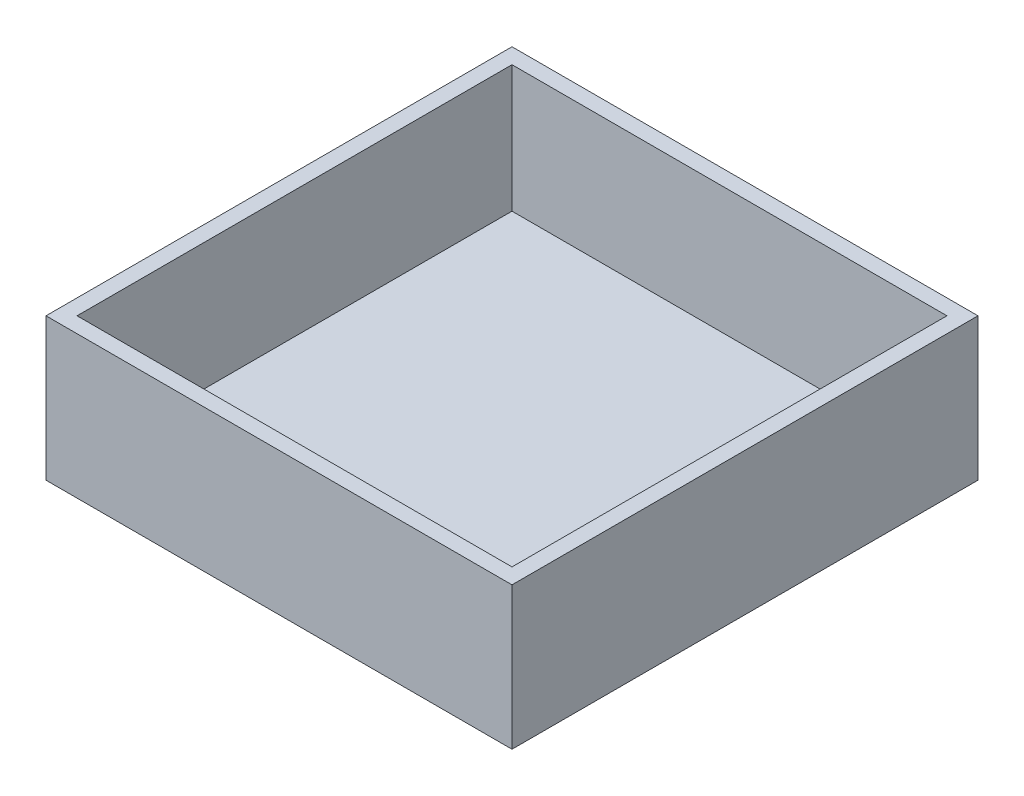
ISO-10303-21;
HEADER;
FILE_DESCRIPTION(('STEP AP214'),'2;1');
FILE_NAME('part.step','',(''),(''),'','','');
FILE_SCHEMA(('AUTOMOTIVE_DESIGN { 1 0 10303 214 1 1 1 1 }'));
ENDSEC;
DATA;
#1=APPLICATION_CONTEXT('core data for automotive mechanical design processes');
#2=APPLICATION_PROTOCOL_DEFINITION('international standard','automotive_design',2000,#1);
#3=PRODUCT_CONTEXT('',#1,'mechanical');
#4=PRODUCT('Part','Part','',(#3));
#5=PRODUCT_RELATED_PRODUCT_CATEGORY('part','',(#4));
#6=PRODUCT_DEFINITION_FORMATION('','',#4);
#7=PRODUCT_DEFINITION_CONTEXT('part definition',#1,'design');
#8=PRODUCT_DEFINITION('design','',#6,#7);
#9=PRODUCT_DEFINITION_SHAPE('','',#8);
#10=(LENGTH_UNIT() NAMED_UNIT(*) SI_UNIT(.MILLI.,.METRE.));
#11=(NAMED_UNIT(*) PLANE_ANGLE_UNIT() SI_UNIT($,.RADIAN.));
#12=(NAMED_UNIT(*) SI_UNIT($,.STERADIAN.) SOLID_ANGLE_UNIT());
#13=UNCERTAINTY_MEASURE_WITH_UNIT(LENGTH_MEASURE(1.E-05),#10,'distance_accuracy_value','');
#14=(GEOMETRIC_REPRESENTATION_CONTEXT(3) GLOBAL_UNCERTAINTY_ASSIGNED_CONTEXT((#13)) GLOBAL_UNIT_ASSIGNED_CONTEXT((#10,
#11,#12)) REPRESENTATION_CONTEXT('',''));
#15=CARTESIAN_POINT('',(0.,0.,0.));
#16=DIRECTION('',(0.,0.,1.));
#17=DIRECTION('',(1.,0.,0.));
#18=AXIS2_PLACEMENT_3D('',#15,#16,#17);
#19=CARTESIAN_POINT('',(45.,27.5,45.));
#20=DIRECTION('',(-1.,0.,0.));
#21=DIRECTION('',(0.,0.,1.));
#22=AXIS2_PLACEMENT_3D('',#19,#20,#21);
#23=PLANE('',#22);
#24=DIRECTION('',(0.,0.,-1.));
#25=VECTOR('',#24,1.);
#26=CARTESIAN_POINT('',(45.,0.,45.));
#27=LINE('',#26,#25);
#28=CARTESIAN_POINT('',(45.,0.,45.));
#29=VERTEX_POINT('',#28);
#30=CARTESIAN_POINT('',(45.,0.,-45.));
#31=VERTEX_POINT('',#30);
#32=EDGE_CURVE('E146',#29,#31,#27,.T.);
#33=ORIENTED_EDGE('',*,*,#32,.T.);
#34=DIRECTION('',(0.,-1.,0.));
#35=VECTOR('',#34,1.);
#36=CARTESIAN_POINT('',(45.,27.5,-45.));
#37=LINE('',#36,#35);
#38=CARTESIAN_POINT('',(45.,27.5,-45.));
#39=VERTEX_POINT('',#38);
#40=EDGE_CURVE('E12',#39,#31,#37,.T.);
#41=ORIENTED_EDGE('',*,*,#40,.F.);
#42=DIRECTION('',(0.,0.,-1.));
#43=VECTOR('',#42,1.);
#44=CARTESIAN_POINT('',(45.,27.5,45.));
#45=LINE('',#44,#43);
#46=CARTESIAN_POINT('',(45.,27.5,45.));
#47=VERTEX_POINT('',#46);
#48=EDGE_CURVE('E147',#47,#39,#45,.T.);
#49=ORIENTED_EDGE('',*,*,#48,.F.);
#50=DIRECTION('',(0.,-1.,0.));
#51=VECTOR('',#50,1.);
#52=CARTESIAN_POINT('',(45.,27.5,45.));
#53=LINE('',#52,#51);
#54=EDGE_CURVE('E153',#47,#29,#53,.T.);
#55=ORIENTED_EDGE('',*,*,#54,.T.);
#56=EDGE_LOOP('',(#33,#41,#49,#55));
#57=FACE_BOUND('',#56,.T.);
#58=ADVANCED_FACE('F35',(#57),#23,.F.);
#59=CARTESIAN_POINT('',(-45.,27.5,-45.));
#60=DIRECTION('',(0.,0.,1.));
#61=DIRECTION('',(1.,0.,0.));
#62=AXIS2_PLACEMENT_3D('',#59,#60,#61);
#63=PLANE('',#62);
#64=DIRECTION('',(-1.,0.,0.));
#65=VECTOR('',#64,1.);
#66=CARTESIAN_POINT('',(-45.,0.,-45.));
#67=LINE('',#66,#65);
#68=CARTESIAN_POINT('',(-45.,0.,-45.));
#69=VERTEX_POINT('',#68);
#70=EDGE_CURVE('E156',#31,#69,#67,.T.);
#71=ORIENTED_EDGE('',*,*,#70,.T.);
#72=DIRECTION('',(0.,-1.,0.));
#73=VECTOR('',#72,1.);
#74=CARTESIAN_POINT('',(-45.,27.5,-45.));
#75=LINE('',#74,#73);
#76=CARTESIAN_POINT('',(-45.,27.5,-45.));
#77=VERTEX_POINT('',#76);
#78=EDGE_CURVE('E42',#77,#69,#75,.T.);
#79=ORIENTED_EDGE('',*,*,#78,.F.);
#80=DIRECTION('',(-1.,0.,0.));
#81=VECTOR('',#80,1.);
#82=CARTESIAN_POINT('',(-45.,27.5,-45.));
#83=LINE('',#82,#81);
#84=EDGE_CURVE('E86',#39,#77,#83,.T.);
#85=ORIENTED_EDGE('',*,*,#84,.F.);
#86=ORIENTED_EDGE('',*,*,#40,.T.);
#87=EDGE_LOOP('',(#71,#79,#85,#86));
#88=FACE_BOUND('',#87,.T.);
#89=ADVANCED_FACE('F185',(#88),#63,.F.);
#90=CARTESIAN_POINT('',(-45.,27.5,45.));
#91=DIRECTION('',(1.,0.,0.));
#92=DIRECTION('',(0.,0.,-1.));
#93=AXIS2_PLACEMENT_3D('',#90,#91,#92);
#94=PLANE('',#93);
#95=DIRECTION('',(0.,0.,1.));
#96=VECTOR('',#95,1.);
#97=CARTESIAN_POINT('',(-45.,0.,45.));
#98=LINE('',#97,#96);
#99=CARTESIAN_POINT('',(-45.,0.,45.));
#100=VERTEX_POINT('',#99);
#101=EDGE_CURVE('E158',#69,#100,#98,.T.);
#102=ORIENTED_EDGE('',*,*,#101,.T.);
#103=DIRECTION('',(0.,-1.,0.));
#104=VECTOR('',#103,1.);
#105=CARTESIAN_POINT('',(-45.,27.5,45.));
#106=LINE('',#105,#104);
#107=CARTESIAN_POINT('',(-45.,27.5,45.));
#108=VERTEX_POINT('',#107);
#109=EDGE_CURVE('E162',#108,#100,#106,.T.);
#110=ORIENTED_EDGE('',*,*,#109,.F.);
#111=DIRECTION('',(0.,0.,1.));
#112=VECTOR('',#111,1.);
#113=CARTESIAN_POINT('',(-45.,27.5,45.));
#114=LINE('',#113,#112);
#115=EDGE_CURVE('E150',#77,#108,#114,.T.);
#116=ORIENTED_EDGE('',*,*,#115,.F.);
#117=ORIENTED_EDGE('',*,*,#78,.T.);
#118=EDGE_LOOP('',(#102,#110,#116,#117));
#119=FACE_BOUND('',#118,.T.);
#120=ADVANCED_FACE('F167',(#119),#94,.F.);
#121=CARTESIAN_POINT('',(-45.,27.5,45.));
#122=DIRECTION('',(0.,0.,-1.));
#123=DIRECTION('',(-1.,0.,0.));
#124=AXIS2_PLACEMENT_3D('',#121,#122,#123);
#125=PLANE('',#124);
#126=DIRECTION('',(1.,0.,0.));
#127=VECTOR('',#126,1.);
#128=CARTESIAN_POINT('',(-45.,0.,45.));
#129=LINE('',#128,#127);
#130=EDGE_CURVE('E79',#100,#29,#129,.T.);
#131=ORIENTED_EDGE('',*,*,#130,.T.);
#132=ORIENTED_EDGE('',*,*,#54,.F.);
#133=DIRECTION('',(1.,0.,0.));
#134=VECTOR('',#133,1.);
#135=CARTESIAN_POINT('',(-45.,27.5,45.));
#136=LINE('',#135,#134);
#137=EDGE_CURVE('E58',#108,#47,#136,.T.);
#138=ORIENTED_EDGE('',*,*,#137,.F.);
#139=ORIENTED_EDGE('',*,*,#109,.T.);
#140=EDGE_LOOP('',(#131,#132,#138,#139));
#141=FACE_BOUND('',#140,.T.);
#142=ADVANCED_FACE('F175',(#141),#125,.F.);
#143=CARTESIAN_POINT('',(0.,27.5,0.));
#144=DIRECTION('',(0.,-1.,0.));
#145=DIRECTION('',(0.,0.,-1.));
#146=AXIS2_PLACEMENT_3D('',#143,#144,#145);
#147=PLANE('',#146);
#148=DIRECTION('',(0.,0.,1.));
#149=VECTOR('',#148,1.);
#150=CARTESIAN_POINT('',(-42.,27.5,42.));
#151=LINE('',#150,#149);
#152=CARTESIAN_POINT('',(-42.,27.5,-42.));
#153=VERTEX_POINT('',#152);
#154=CARTESIAN_POINT('',(-42.,27.5,42.));
#155=VERTEX_POINT('',#154);
#156=EDGE_CURVE('E132',#153,#155,#151,.T.);
#157=ORIENTED_EDGE('',*,*,#156,.F.);
#158=DIRECTION('',(-1.,0.,0.));
#159=VECTOR('',#158,1.);
#160=CARTESIAN_POINT('',(-42.,27.5,-42.));
#161=LINE('',#160,#159);
#162=CARTESIAN_POINT('',(42.,27.5,-42.));
#163=VERTEX_POINT('',#162);
#164=EDGE_CURVE('E125',#163,#153,#161,.T.);
#165=ORIENTED_EDGE('',*,*,#164,.F.);
#166=DIRECTION('',(0.,0.,-1.));
#167=VECTOR('',#166,1.);
#168=CARTESIAN_POINT('',(42.,27.5,42.));
#169=LINE('',#168,#167);
#170=CARTESIAN_POINT('',(42.,27.5,42.));
#171=VERTEX_POINT('',#170);
#172=EDGE_CURVE('E136',#171,#163,#169,.T.);
#173=ORIENTED_EDGE('',*,*,#172,.F.);
#174=DIRECTION('',(1.,0.,0.));
#175=VECTOR('',#174,1.);
#176=CARTESIAN_POINT('',(-42.,27.5,42.));
#177=LINE('',#176,#175);
#178=EDGE_CURVE('E49',#155,#171,#177,.T.);
#179=ORIENTED_EDGE('',*,*,#178,.F.);
#180=EDGE_LOOP('',(#157,#165,#173,#179));
#181=FACE_BOUND('',#180,.T.);
#182=ORIENTED_EDGE('',*,*,#48,.T.);
#183=ORIENTED_EDGE('',*,*,#84,.T.);
#184=ORIENTED_EDGE('',*,*,#115,.T.);
#185=ORIENTED_EDGE('',*,*,#137,.T.);
#186=EDGE_LOOP('',(#182,#183,#184,#185));
#187=FACE_BOUND('',#186,.T.);
#188=ADVANCED_FACE('F177',(#181,#187),#147,.F.);
#189=CARTESIAN_POINT('',(0.,0.,0.));
#190=DIRECTION('',(0.,-1.,0.));
#191=DIRECTION('',(0.,0.,-1.));
#192=AXIS2_PLACEMENT_3D('',#189,#190,#191);
#193=PLANE('',#192);
#194=ORIENTED_EDGE('',*,*,#32,.F.);
#195=ORIENTED_EDGE('',*,*,#130,.F.);
#196=ORIENTED_EDGE('',*,*,#101,.F.);
#197=ORIENTED_EDGE('',*,*,#70,.F.);
#198=EDGE_LOOP('',(#194,#195,#196,#197));
#199=FACE_BOUND('',#198,.T.);
#200=ADVANCED_FACE('F171',(#199),#193,.T.);
#201=CARTESIAN_POINT('',(0.,3.,0.));
#202=DIRECTION('',(0.,-1.,0.));
#203=DIRECTION('',(0.,0.,-1.));
#204=AXIS2_PLACEMENT_3D('',#201,#202,#203);
#205=PLANE('',#204);
#206=DIRECTION('',(0.,0.,-1.));
#207=VECTOR('',#206,1.);
#208=CARTESIAN_POINT('',(42.,3.,42.));
#209=LINE('',#208,#207);
#210=CARTESIAN_POINT('',(42.,3.,42.));
#211=VERTEX_POINT('',#210);
#212=CARTESIAN_POINT('',(42.,3.,-42.));
#213=VERTEX_POINT('',#212);
#214=EDGE_CURVE('E129',#211,#213,#209,.T.);
#215=ORIENTED_EDGE('',*,*,#214,.T.);
#216=DIRECTION('',(-1.,0.,0.));
#217=VECTOR('',#216,1.);
#218=CARTESIAN_POINT('',(-42.,3.,-42.));
#219=LINE('',#218,#217);
#220=CARTESIAN_POINT('',(-42.,3.,-42.));
#221=VERTEX_POINT('',#220);
#222=EDGE_CURVE('E122',#213,#221,#219,.T.);
#223=ORIENTED_EDGE('',*,*,#222,.T.);
#224=DIRECTION('',(0.,0.,1.));
#225=VECTOR('',#224,1.);
#226=CARTESIAN_POINT('',(-42.,3.,42.));
#227=LINE('',#226,#225);
#228=CARTESIAN_POINT('',(-42.,3.,42.));
#229=VERTEX_POINT('',#228);
#230=EDGE_CURVE('E109',#221,#229,#227,.T.);
#231=ORIENTED_EDGE('',*,*,#230,.T.);
#232=DIRECTION('',(1.,0.,0.));
#233=VECTOR('',#232,1.);
#234=CARTESIAN_POINT('',(-42.,3.,42.));
#235=LINE('',#234,#233);
#236=EDGE_CURVE('E141',#229,#211,#235,.T.);
#237=ORIENTED_EDGE('',*,*,#236,.T.);
#238=EDGE_LOOP('',(#215,#223,#231,#237));
#239=FACE_BOUND('',#238,.T.);
#240=ADVANCED_FACE('F128',(#239),#205,.F.);
#241=CARTESIAN_POINT('',(-42.,-118.79393923934,-42.));
#242=DIRECTION('',(0.,0.,-1.));
#243=DIRECTION('',(-1.,0.,0.));
#244=AXIS2_PLACEMENT_3D('',#241,#242,#243);
#245=PLANE('',#244);
#246=DIRECTION('',(0.,1.,0.));
#247=VECTOR('',#246,1.);
#248=CARTESIAN_POINT('',(42.,-118.79393923934,-42.));
#249=LINE('',#248,#247);
#250=EDGE_CURVE('E139',#213,#163,#249,.T.);
#251=ORIENTED_EDGE('',*,*,#250,.T.);
#252=ORIENTED_EDGE('',*,*,#164,.T.);
#253=DIRECTION('',(0.,1.,0.));
#254=VECTOR('',#253,1.);
#255=CARTESIAN_POINT('',(-42.,-118.79393923934,-42.));
#256=LINE('',#255,#254);
#257=EDGE_CURVE('E113',#221,#153,#256,.T.);
#258=ORIENTED_EDGE('',*,*,#257,.F.);
#259=ORIENTED_EDGE('',*,*,#222,.F.);
#260=EDGE_LOOP('',(#251,#252,#258,#259));
#261=FACE_BOUND('',#260,.T.);
#262=ADVANCED_FACE('F121',(#261),#245,.F.);
#263=CARTESIAN_POINT('',(-42.,-118.79393923934,42.));
#264=DIRECTION('',(-1.,0.,0.));
#265=DIRECTION('',(0.,0.,1.));
#266=AXIS2_PLACEMENT_3D('',#263,#264,#265);
#267=PLANE('',#266);
#268=ORIENTED_EDGE('',*,*,#257,.T.);
#269=ORIENTED_EDGE('',*,*,#156,.T.);
#270=DIRECTION('',(0.,1.,0.));
#271=VECTOR('',#270,1.);
#272=CARTESIAN_POINT('',(-42.,-118.79393923934,42.));
#273=LINE('',#272,#271);
#274=EDGE_CURVE('E115',#229,#155,#273,.T.);
#275=ORIENTED_EDGE('',*,*,#274,.F.);
#276=ORIENTED_EDGE('',*,*,#230,.F.);
#277=EDGE_LOOP('',(#268,#269,#275,#276));
#278=FACE_BOUND('',#277,.T.);
#279=ADVANCED_FACE('F111',(#278),#267,.F.);
#280=CARTESIAN_POINT('',(-42.,-118.79393923934,42.));
#281=DIRECTION('',(0.,0.,1.));
#282=DIRECTION('',(1.,0.,0.));
#283=AXIS2_PLACEMENT_3D('',#280,#281,#282);
#284=PLANE('',#283);
#285=ORIENTED_EDGE('',*,*,#274,.T.);
#286=ORIENTED_EDGE('',*,*,#178,.T.);
#287=DIRECTION('',(0.,1.,0.));
#288=VECTOR('',#287,1.);
#289=CARTESIAN_POINT('',(42.,-118.79393923934,42.));
#290=LINE('',#289,#288);
#291=EDGE_CURVE('E140',#211,#171,#290,.T.);
#292=ORIENTED_EDGE('',*,*,#291,.F.);
#293=ORIENTED_EDGE('',*,*,#236,.F.);
#294=EDGE_LOOP('',(#285,#286,#292,#293));
#295=FACE_BOUND('',#294,.T.);
#296=ADVANCED_FACE('F240',(#295),#284,.F.);
#297=CARTESIAN_POINT('',(42.,-118.79393923934,42.));
#298=DIRECTION('',(1.,0.,0.));
#299=DIRECTION('',(0.,0.,-1.));
#300=AXIS2_PLACEMENT_3D('',#297,#298,#299);
#301=PLANE('',#300);
#302=ORIENTED_EDGE('',*,*,#291,.T.);
#303=ORIENTED_EDGE('',*,*,#172,.T.);
#304=ORIENTED_EDGE('',*,*,#250,.F.);
#305=ORIENTED_EDGE('',*,*,#214,.F.);
#306=EDGE_LOOP('',(#302,#303,#304,#305));
#307=FACE_BOUND('',#306,.T.);
#308=ADVANCED_FACE('F249',(#307),#301,.F.);
#309=CLOSED_SHELL('',(#58,#89,#120,#142,#188,#200,#240,#262,#279,#296,#308));
#310=MANIFOLD_SOLID_BREP('B2',#309);
#311=ADVANCED_BREP_SHAPE_REPRESENTATION('',(#18,#310),#14);
#312=SHAPE_DEFINITION_REPRESENTATION(#9,#311);
ENDSEC;
END-ISO-10303-21;
